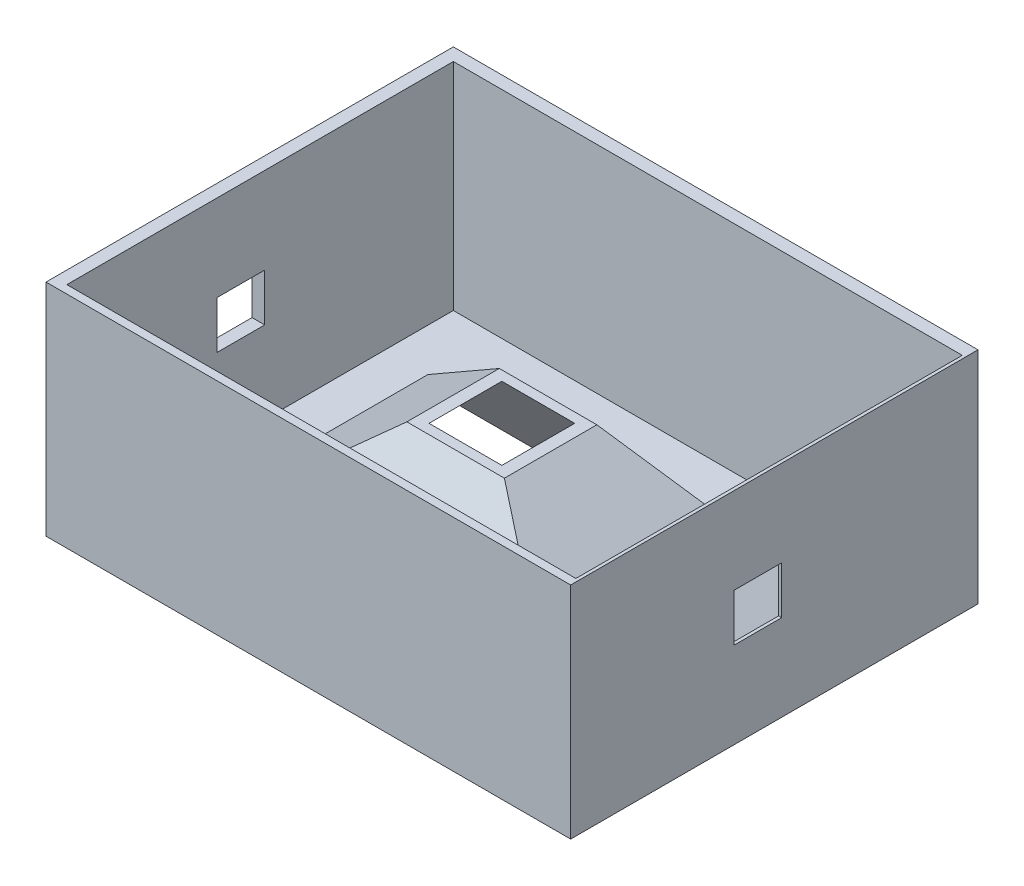
ISO-10303-21;
HEADER;
FILE_DESCRIPTION(('STEP AP214'),'2;1');
FILE_NAME('part.step','',(''),(''),'','','');
FILE_SCHEMA(('AUTOMOTIVE_DESIGN { 1 0 10303 214 1 1 1 1 }'));
ENDSEC;
DATA;
#1=APPLICATION_CONTEXT('core data for automotive mechanical design processes');
#2=APPLICATION_PROTOCOL_DEFINITION('international standard','automotive_design',2000,#1);
#3=PRODUCT_CONTEXT('',#1,'mechanical');
#4=PRODUCT('Part','Part','',(#3));
#5=PRODUCT_RELATED_PRODUCT_CATEGORY('part','',(#4));
#6=PRODUCT_DEFINITION_FORMATION('','',#4);
#7=PRODUCT_DEFINITION_CONTEXT('part definition',#1,'design');
#8=PRODUCT_DEFINITION('design','',#6,#7);
#9=PRODUCT_DEFINITION_SHAPE('','',#8);
#10=(LENGTH_UNIT() NAMED_UNIT(*) SI_UNIT(.MILLI.,.METRE.));
#11=(NAMED_UNIT(*) PLANE_ANGLE_UNIT() SI_UNIT($,.RADIAN.));
#12=(NAMED_UNIT(*) SI_UNIT($,.STERADIAN.) SOLID_ANGLE_UNIT());
#13=UNCERTAINTY_MEASURE_WITH_UNIT(LENGTH_MEASURE(1.E-05),#10,'distance_accuracy_value','');
#14=(GEOMETRIC_REPRESENTATION_CONTEXT(3) GLOBAL_UNCERTAINTY_ASSIGNED_CONTEXT((#13)) GLOBAL_UNIT_ASSIGNED_CONTEXT((#10,
#11,#12)) REPRESENTATION_CONTEXT('',''));
#15=CARTESIAN_POINT('',(0.,0.,0.));
#16=DIRECTION('',(0.,0.,1.));
#17=DIRECTION('',(1.,0.,0.));
#18=AXIS2_PLACEMENT_3D('',#15,#16,#17);
#19=CARTESIAN_POINT('',(-28.3594938145611,-48.5882852291101,56.9391919493883));
#20=DIRECTION('',(0.,1.,0.));
#21=DIRECTION('',(-1.,0.,0.));
#22=AXIS2_PLACEMENT_3D('',#19,#20,#21);
#23=PLANE('',#22);
#24=DIRECTION('',(-1.,0.,0.));
#25=VECTOR('',#24,1.);
#26=CARTESIAN_POINT('',(136.041599309488,-48.5882852291113,57.9748259053129));
#27=LINE('',#26,#25);
#28=CARTESIAN_POINT('',(134.350506185439,-48.5882852291113,57.9748259053129));
#29=VERTEX_POINT('',#28);
#30=CARTESIAN_POINT('',(-12.8594938145611,-48.5882852291103,57.9748259053129));
#31=VERTEX_POINT('',#30);
#32=EDGE_CURVE('E357',#29,#31,#27,.T.);
#33=ORIENTED_EDGE('',*,*,#32,.F.);
#34=DIRECTION('',(0.,0.,-1.));
#35=VECTOR('',#34,1.);
#36=CARTESIAN_POINT('',(134.350506185439,-48.5882852291113,56.9391919493883));
#37=LINE('',#36,#35);
#38=CARTESIAN_POINT('',(134.350506185439,-48.5882852291113,36.4391919493883));
#39=VERTEX_POINT('',#38);
#40=EDGE_CURVE('E422',#29,#39,#37,.T.);
#41=ORIENTED_EDGE('',*,*,#40,.T.);
#42=DIRECTION('',(-1.,0.,0.));
#43=VECTOR('',#42,1.);
#44=CARTESIAN_POINT('',(-28.3594938145611,-48.5882852291101,36.4391919493883));
#45=LINE('',#44,#43);
#46=CARTESIAN_POINT('',(-26.3594938145611,-48.5882852291102,36.4391919493883));
#47=VERTEX_POINT('',#46);
#48=EDGE_CURVE('E420',#39,#47,#45,.T.);
#49=ORIENTED_EDGE('',*,*,#48,.T.);
#50=DIRECTION('',(0.,0.,1.));
#51=VECTOR('',#50,1.);
#52=CARTESIAN_POINT('',(-26.3594938145611,-48.5882852291102,56.9391919493883));
#53=LINE('',#52,#51);
#54=CARTESIAN_POINT('',(-26.3594938145612,-48.5882852291102,158.464704984142));
#55=VERTEX_POINT('',#54);
#56=EDGE_CURVE('E418',#47,#55,#53,.T.);
#57=ORIENTED_EDGE('',*,*,#56,.T.);
#58=DIRECTION('',(1.,0.,0.));
#59=VECTOR('',#58,1.);
#60=CARTESIAN_POINT('',(-28.3594938145611,-48.5882852291102,158.464704984142));
#61=LINE('',#60,#59);
#62=CARTESIAN_POINT('',(-12.8594938145611,-48.5882852291103,158.464704984142));
#63=VERTEX_POINT('',#62);
#64=EDGE_CURVE('E398',#55,#63,#61,.T.);
#65=ORIENTED_EDGE('',*,*,#64,.T.);
#66=DIRECTION('',(0.,0.,1.));
#67=VECTOR('',#66,1.);
#68=CARTESIAN_POINT('',(-12.8594938145611,-48.5882852291103,56.9391919493883));
#69=LINE('',#68,#67);
#70=EDGE_CURVE('E360',#31,#63,#69,.T.);
#71=ORIENTED_EDGE('',*,*,#70,.F.);
#72=EDGE_LOOP('',(#33,#41,#49,#57,#65,#71));
#73=FACE_BOUND('',#72,.T.);
#74=ADVANCED_FACE('F91',(#73),#23,.T.);
#75=CARTESIAN_POINT('',(-10.6494938145611,-48.5212413100698,158.415521565134));
#76=DIRECTION('',(0.,0.591503475972063,0.806302448162578));
#77=DIRECTION('',(1.,0.,0.));
#78=AXIS2_PLACEMENT_3D('',#75,#76,#77);
#79=PLANE('',#78);
#80=DIRECTION('',(0.694725706687846,0.579953006668207,-0.425453525691797));
#81=VECTOR('',#80,1.);
#82=CARTESIAN_POINT('',(16.7301614495524,-23.8870119474395,140.343850904708));
#83=LINE('',#82,#81);
#84=CARTESIAN_POINT('',(45.3444130613901,0.,122.820338940067));
#85=VERTEX_POINT('',#84);
#86=EDGE_CURVE('E402',#63,#85,#83,.T.);
#87=ORIENTED_EDGE('',*,*,#86,.F.);
#88=DIRECTION('',(-1.,0.,0.));
#89=VECTOR('',#88,1.);
#90=CARTESIAN_POINT('',(136.041599309488,-48.5882852291113,158.464704984142));
#91=LINE('',#90,#89);
#92=CARTESIAN_POINT('',(134.350506185439,-48.5882852291113,158.464704984142));
#93=VERTEX_POINT('',#92);
#94=EDGE_CURVE('E354',#93,#63,#91,.T.);
#95=ORIENTED_EDGE('',*,*,#94,.F.);
#96=DIRECTION('',(-0.694725706687841,0.579953006668214,-0.425453525691795));
#97=VECTOR('',#96,1.);
#98=CARTESIAN_POINT('',(64.3256042288777,9.86809840605227,115.581101949387));
#99=LINE('',#98,#97);
#100=CARTESIAN_POINT('',(76.1465993094875,0.,122.820338940067));
#101=VERTEX_POINT('',#100);
#102=EDGE_CURVE('E400',#93,#101,#99,.T.);
#103=ORIENTED_EDGE('',*,*,#102,.T.);
#104=DIRECTION('',(1.,0.,0.));
#105=VECTOR('',#104,1.);
#106=CARTESIAN_POINT('',(6.30499229032088E-13,0.,122.820338940067));
#107=LINE('',#106,#105);
#108=EDGE_CURVE('E367',#85,#101,#107,.T.);
#109=ORIENTED_EDGE('',*,*,#108,.F.);
#110=EDGE_LOOP('',(#87,#95,#103,#109));
#111=FACE_BOUND('',#110,.T.);
#112=ADVANCED_FACE('F93',(#111),#79,.T.);
#113=CARTESIAN_POINT('',(132.140506185439,-48.5212413100708,58.024009324321));
#114=DIRECTION('',(0.,0.591503475972062,-0.806302448162579));
#115=DIRECTION('',(-1.,0.,0.));
#116=AXIS2_PLACEMENT_3D('',#113,#114,#115);
#117=PLANE('',#116);
#118=DIRECTION('',(-0.694725706687841,0.579953006668214,0.425453525691794));
#119=VECTOR('',#118,1.);
#120=CARTESIAN_POINT('',(104.760850921326,-23.8870119474403,76.0956799847464));
#121=LINE('',#120,#119);
#122=CARTESIAN_POINT('',(76.1465993094875,0.,93.6191919493883));
#123=VERTEX_POINT('',#122);
#124=EDGE_CURVE('E396',#29,#123,#121,.T.);
#125=ORIENTED_EDGE('',*,*,#124,.F.);
#126=ORIENTED_EDGE('',*,*,#32,.T.);
#127=DIRECTION('',(0.694725706687846,0.579953006668207,0.425453525691796));
#128=VECTOR('',#127,1.);
#129=CARTESIAN_POINT('',(57.1654081420003,9.86809840605238,100.858428940068));
#130=LINE('',#129,#128);
#131=CARTESIAN_POINT('',(45.3444130613901,0.,93.6191919493881));
#132=VERTEX_POINT('',#131);
#133=EDGE_CURVE('E399',#31,#132,#130,.T.);
#134=ORIENTED_EDGE('',*,*,#133,.T.);
#135=DIRECTION('',(-1.,0.,0.));
#136=VECTOR('',#135,1.);
#137=CARTESIAN_POINT('',(-4.80594898663319E-13,0.,93.6191919493879));
#138=LINE('',#137,#136);
#139=EDGE_CURVE('E408',#123,#132,#138,.T.);
#140=ORIENTED_EDGE('',*,*,#139,.F.);
#141=EDGE_LOOP('',(#125,#126,#134,#140));
#142=FACE_BOUND('',#141,.T.);
#143=ADVANCED_FACE('F465',(#142),#117,.T.);
#144=CARTESIAN_POINT('',(-12.2516088631539,-48.0808263832907,60.0397654447275));
#145=DIRECTION('',(-0.640846019437088,0.767669446683688,0.));
#146=DIRECTION('',(0.,0.,1.));
#147=AXIS2_PLACEMENT_3D('',#144,#145,#146);
#148=PLANE('',#147);
#149=ORIENTED_EDGE('',*,*,#133,.F.);
#150=ORIENTED_EDGE('',*,*,#70,.T.);
#151=ORIENTED_EDGE('',*,*,#86,.T.);
#152=DIRECTION('',(0.,0.,1.));
#153=VECTOR('',#152,1.);
#154=CARTESIAN_POINT('',(45.3444130613901,0.,0.));
#155=LINE('',#154,#153);
#156=EDGE_CURVE('E411',#132,#85,#155,.T.);
#157=ORIENTED_EDGE('',*,*,#156,.F.);
#158=EDGE_LOOP('',(#149,#150,#151,#157));
#159=FACE_BOUND('',#158,.T.);
#160=ADVANCED_FACE('F499',(#159),#148,.T.);
#161=CARTESIAN_POINT('',(133.742621234032,-48.0808263832917,156.399765444727));
#162=DIRECTION('',(0.640846019437095,0.767669446683682,0.));
#163=DIRECTION('',(0.,0.,-1.));
#164=AXIS2_PLACEMENT_3D('',#161,#162,#163);
#165=PLANE('',#164);
#166=DIRECTION('',(0.,0.,-1.));
#167=VECTOR('',#166,1.);
#168=CARTESIAN_POINT('',(134.350506185439,-48.5882852291113,159.500338940067));
#169=LINE('',#168,#167);
#170=EDGE_CURVE('E350',#93,#29,#169,.T.);
#171=ORIENTED_EDGE('',*,*,#170,.T.);
#172=ORIENTED_EDGE('',*,*,#124,.T.);
#173=DIRECTION('',(0.,0.,-1.));
#174=VECTOR('',#173,1.);
#175=CARTESIAN_POINT('',(76.1465993094875,0.,0.));
#176=LINE('',#175,#174);
#177=EDGE_CURVE('E403',#101,#123,#176,.T.);
#178=ORIENTED_EDGE('',*,*,#177,.F.);
#179=ORIENTED_EDGE('',*,*,#102,.F.);
#180=EDGE_LOOP('',(#171,#172,#178,#179));
#181=FACE_BOUND('',#180,.T.);
#182=ADVANCED_FACE('F492',(#181),#165,.T.);
#183=CARTESIAN_POINT('',(-3.4988469856525E-13,-50.,0.));
#184=DIRECTION('',(0.,1.,0.));
#185=DIRECTION('',(-1.,0.,0.));
#186=AXIS2_PLACEMENT_3D('',#183,#184,#185);
#187=PLANE('',#186);
#188=DIRECTION('',(-1.,0.,0.));
#189=VECTOR('',#188,1.);
#190=CARTESIAN_POINT('',(136.041599309488,-50.0000000000004,32.4391919493883));
#191=LINE('',#190,#189);
#192=CARTESIAN_POINT('',(135.311599309488,-50.0000000000004,32.4391919493883));
#193=VERTEX_POINT('',#192);
#194=CARTESIAN_POINT('',(-30.3594938145612,-49.9999999999998,32.4391919493883));
#195=VERTEX_POINT('',#194);
#196=EDGE_CURVE('E352',#193,#195,#191,.T.);
#197=ORIENTED_EDGE('',*,*,#196,.F.);
#198=DIRECTION('',(0.,0.,-1.));
#199=VECTOR('',#198,1.);
#200=CARTESIAN_POINT('',(135.311599309488,-50.0000000000004,162.549627647113));
#201=LINE('',#200,#199);
#202=CARTESIAN_POINT('',(135.311599309488,-50.0000000000004,161.060338940067));
#203=VERTEX_POINT('',#202);
#204=EDGE_CURVE('E348',#203,#193,#201,.T.);
#205=ORIENTED_EDGE('',*,*,#204,.F.);
#206=DIRECTION('',(1.,0.,0.));
#207=VECTOR('',#206,1.);
#208=CARTESIAN_POINT('',(-28.3588621198068,-49.9999999999998,161.060338940067));
#209=LINE('',#208,#207);
#210=CARTESIAN_POINT('',(-30.3594938145612,-49.9999999999998,161.060338940067));
#211=VERTEX_POINT('',#210);
#212=EDGE_CURVE('E341',#211,#203,#209,.T.);
#213=ORIENTED_EDGE('',*,*,#212,.F.);
#214=DIRECTION('',(0.,0.,1.));
#215=VECTOR('',#214,1.);
#216=CARTESIAN_POINT('',(-30.3594938145612,-49.9999999999998,32.4391919493883));
#217=LINE('',#216,#215);
#218=EDGE_CURVE('E336',#195,#211,#217,.T.);
#219=ORIENTED_EDGE('',*,*,#218,.F.);
#220=EDGE_LOOP('',(#197,#205,#213,#219));
#221=FACE_BOUND('',#220,.T.);
#222=DIRECTION('',(0.,0.,1.));
#223=VECTOR('',#222,1.);
#224=CARTESIAN_POINT('',(-10.6494938145612,-49.9999999999999,108.219765444727));
#225=LINE('',#224,#223);
#226=CARTESIAN_POINT('',(-10.6494938145612,-49.9999999999999,60.0397654447275));
#227=VERTEX_POINT('',#226);
#228=CARTESIAN_POINT('',(-10.6494938145612,-49.9999999999999,156.399765444727));
#229=VERTEX_POINT('',#228);
#230=EDGE_CURVE('E377',#227,#229,#225,.T.);
#231=ORIENTED_EDGE('',*,*,#230,.T.);
#232=DIRECTION('',(1.,0.,0.));
#233=VECTOR('',#232,1.);
#234=CARTESIAN_POINT('',(60.7455061854388,-50.0000000000004,156.399765444727));
#235=LINE('',#234,#233);
#236=CARTESIAN_POINT('',(132.140506185439,-50.0000000000009,156.399765444727));
#237=VERTEX_POINT('',#236);
#238=EDGE_CURVE('E382',#229,#237,#235,.T.);
#239=ORIENTED_EDGE('',*,*,#238,.T.);
#240=DIRECTION('',(0.,0.,-1.));
#241=VECTOR('',#240,1.);
#242=CARTESIAN_POINT('',(132.140506185439,-50.0000000000009,108.219765444727));
#243=LINE('',#242,#241);
#244=CARTESIAN_POINT('',(132.140506185439,-50.0000000000009,60.0397654447275));
#245=VERTEX_POINT('',#244);
#246=EDGE_CURVE('E364',#237,#245,#243,.T.);
#247=ORIENTED_EDGE('',*,*,#246,.T.);
#248=DIRECTION('',(-1.,0.,0.));
#249=VECTOR('',#248,1.);
#250=CARTESIAN_POINT('',(60.7455061854388,-50.0000000000004,60.0397654447275));
#251=LINE('',#250,#249);
#252=EDGE_CURVE('E371',#245,#227,#251,.T.);
#253=ORIENTED_EDGE('',*,*,#252,.T.);
#254=EDGE_LOOP('',(#231,#239,#247,#253));
#255=FACE_BOUND('',#254,.T.);
#256=ADVANCED_FACE('F489',(#221,#255),#187,.F.);
#257=CARTESIAN_POINT('',(0.,0.,0.));
#258=DIRECTION('',(0.,1.,0.));
#259=DIRECTION('',(0.,0.,1.));
#260=AXIS2_PLACEMENT_3D('',#257,#258,#259);
#261=PLANE('',#260);
#262=DIRECTION('',(0.,0.,-1.));
#263=VECTOR('',#262,1.);
#264=CARTESIAN_POINT('',(72.2455061854388,0.,108.219765444727));
#265=LINE('',#264,#263);
#266=CARTESIAN_POINT('',(72.2455061854388,0.,119.719765444727));
#267=VERTEX_POINT('',#266);
#268=CARTESIAN_POINT('',(72.2455061854388,0.,96.7197654447275));
#269=VERTEX_POINT('',#268);
#270=EDGE_CURVE('E388',#267,#269,#265,.T.);
#271=ORIENTED_EDGE('',*,*,#270,.F.);
#272=DIRECTION('',(1.,0.,0.));
#273=VECTOR('',#272,1.);
#274=CARTESIAN_POINT('',(60.7455061854388,0.,119.719765444727));
#275=LINE('',#274,#273);
#276=CARTESIAN_POINT('',(49.2455061854388,0.,119.719765444727));
#277=VERTEX_POINT('',#276);
#278=EDGE_CURVE('E363',#277,#267,#275,.T.);
#279=ORIENTED_EDGE('',*,*,#278,.F.);
#280=DIRECTION('',(0.,0.,1.));
#281=VECTOR('',#280,1.);
#282=CARTESIAN_POINT('',(49.2455061854388,0.,108.219765444727));
#283=LINE('',#282,#281);
#284=CARTESIAN_POINT('',(49.2455061854388,0.,96.7197654447275));
#285=VERTEX_POINT('',#284);
#286=EDGE_CURVE('E392',#285,#277,#283,.T.);
#287=ORIENTED_EDGE('',*,*,#286,.F.);
#288=DIRECTION('',(-1.,0.,0.));
#289=VECTOR('',#288,1.);
#290=CARTESIAN_POINT('',(60.7455061854388,0.,96.7197654447275));
#291=LINE('',#290,#289);
#292=EDGE_CURVE('E390',#269,#285,#291,.T.);
#293=ORIENTED_EDGE('',*,*,#292,.F.);
#294=EDGE_LOOP('',(#271,#279,#287,#293));
#295=FACE_BOUND('',#294,.T.);
#296=ORIENTED_EDGE('',*,*,#177,.T.);
#297=ORIENTED_EDGE('',*,*,#139,.T.);
#298=ORIENTED_EDGE('',*,*,#156,.T.);
#299=ORIENTED_EDGE('',*,*,#108,.T.);
#300=EDGE_LOOP('',(#296,#297,#298,#299));
#301=FACE_BOUND('',#300,.T.);
#302=ADVANCED_FACE('F476',(#295,#301),#261,.T.);
#303=CARTESIAN_POINT('',(132.140506185439,-50.0000000000009,156.399765444727));
#304=DIRECTION('',(0.640846019437095,0.767669446683682,0.));
#305=DIRECTION('',(0.,0.,-1.));
#306=AXIS2_PLACEMENT_3D('',#303,#304,#305);
#307=PLANE('',#306);
#308=ORIENTED_EDGE('',*,*,#246,.F.);
#309=DIRECTION('',(-0.694725706687841,0.579953006668214,-0.425453525691794));
#310=VECTOR('',#309,1.);
#311=CARTESIAN_POINT('',(102.193006185439,-25.0000000000005,138.059765444727));
#312=LINE('',#311,#310);
#313=EDGE_CURVE('E385',#237,#267,#312,.T.);
#314=ORIENTED_EDGE('',*,*,#313,.T.);
#315=ORIENTED_EDGE('',*,*,#270,.T.);
#316=DIRECTION('',(-0.694725706687841,0.579953006668214,0.425453525691794));
#317=VECTOR('',#316,1.);
#318=CARTESIAN_POINT('',(102.193006185439,-25.0000000000005,78.3797654447275));
#319=LINE('',#318,#317);
#320=EDGE_CURVE('E368',#245,#269,#319,.T.);
#321=ORIENTED_EDGE('',*,*,#320,.F.);
#322=EDGE_LOOP('',(#308,#314,#315,#321));
#323=FACE_BOUND('',#322,.T.);
#324=ADVANCED_FACE('F472',(#323),#307,.F.);
#325=CARTESIAN_POINT('',(132.140506185439,-50.0000000000009,60.0397654447275));
#326=DIRECTION('',(0.,0.591503475972062,-0.806302448162579));
#327=DIRECTION('',(-1.,0.,0.));
#328=AXIS2_PLACEMENT_3D('',#325,#326,#327);
#329=PLANE('',#328);
#330=ORIENTED_EDGE('',*,*,#252,.F.);
#331=ORIENTED_EDGE('',*,*,#320,.T.);
#332=ORIENTED_EDGE('',*,*,#292,.T.);
#333=DIRECTION('',(0.694725706687846,0.579953006668207,0.425453525691797));
#334=VECTOR('',#333,1.);
#335=CARTESIAN_POINT('',(19.2980061854388,-25.,78.3797654447275));
#336=LINE('',#335,#334);
#337=EDGE_CURVE('E374',#227,#285,#336,.T.);
#338=ORIENTED_EDGE('',*,*,#337,.F.);
#339=EDGE_LOOP('',(#330,#331,#332,#338));
#340=FACE_BOUND('',#339,.T.);
#341=ADVANCED_FACE('F475',(#340),#329,.F.);
#342=CARTESIAN_POINT('',(-10.6494938145612,-49.9999999999999,60.0397654447275));
#343=DIRECTION('',(-0.640846019437088,0.767669446683688,0.));
#344=DIRECTION('',(0.,0.,1.));
#345=AXIS2_PLACEMENT_3D('',#342,#343,#344);
#346=PLANE('',#345);
#347=ORIENTED_EDGE('',*,*,#230,.F.);
#348=ORIENTED_EDGE('',*,*,#337,.T.);
#349=ORIENTED_EDGE('',*,*,#286,.T.);
#350=DIRECTION('',(0.694725706687846,0.579953006668207,-0.425453525691797));
#351=VECTOR('',#350,1.);
#352=CARTESIAN_POINT('',(19.2980061854388,-25.,138.059765444727));
#353=LINE('',#352,#351);
#354=EDGE_CURVE('E380',#229,#277,#353,.T.);
#355=ORIENTED_EDGE('',*,*,#354,.F.);
#356=EDGE_LOOP('',(#347,#348,#349,#355));
#357=FACE_BOUND('',#356,.T.);
#358=ADVANCED_FACE('F480',(#357),#346,.F.);
#359=CARTESIAN_POINT('',(-10.6494938145612,-49.9999999999999,156.399765444727));
#360=DIRECTION('',(0.,0.591503475972063,0.806302448162578));
#361=DIRECTION('',(1.,0.,0.));
#362=AXIS2_PLACEMENT_3D('',#359,#360,#361);
#363=PLANE('',#362);
#364=ORIENTED_EDGE('',*,*,#238,.F.);
#365=ORIENTED_EDGE('',*,*,#354,.T.);
#366=ORIENTED_EDGE('',*,*,#278,.T.);
#367=ORIENTED_EDGE('',*,*,#313,.F.);
#368=EDGE_LOOP('',(#364,#365,#366,#367));
#369=FACE_BOUND('',#368,.T.);
#370=ADVANCED_FACE('F484',(#369),#363,.F.);
#371=CARTESIAN_POINT('',(0.,0.,32.4391919493883));
#372=DIRECTION('',(0.,0.,-1.));
#373=DIRECTION('',(-1.,0.,0.));
#374=AXIS2_PLACEMENT_3D('',#371,#372,#373);
#375=PLANE('',#374);
#376=DIRECTION('',(1.,0.,0.));
#377=VECTOR('',#376,1.);
#378=CARTESIAN_POINT('',(-30.3594938145607,19.5000000000002,32.4391919493883));
#379=LINE('',#378,#377);
#380=CARTESIAN_POINT('',(-30.3594938145607,19.5000000000002,32.4391919493883));
#381=VERTEX_POINT('',#380);
#382=CARTESIAN_POINT('',(135.311599309488,19.4999999999991,32.4391919493883));
#383=VERTEX_POINT('',#382);
#384=EDGE_CURVE('E324',#381,#383,#379,.T.);
#385=ORIENTED_EDGE('',*,*,#384,.T.);
#386=DIRECTION('',(0.,1.,0.));
#387=VECTOR('',#386,1.);
#388=CARTESIAN_POINT('',(135.311599309488,-48.5882852291113,32.4391919493883));
#389=LINE('',#388,#387);
#390=EDGE_CURVE('E346',#193,#383,#389,.T.);
#391=ORIENTED_EDGE('',*,*,#390,.F.);
#392=ORIENTED_EDGE('',*,*,#196,.T.);
#393=DIRECTION('',(0.,-1.,0.));
#394=VECTOR('',#393,1.);
#395=CARTESIAN_POINT('',(-30.3594938145612,-48.5882852291113,32.4391919493883));
#396=LINE('',#395,#394);
#397=EDGE_CURVE('E333',#381,#195,#396,.T.);
#398=ORIENTED_EDGE('',*,*,#397,.F.);
#399=EDGE_LOOP('',(#385,#391,#392,#398));
#400=FACE_BOUND('',#399,.T.);
#401=ADVANCED_FACE('F470',(#400),#375,.T.);
#402=CARTESIAN_POINT('',(135.311599309488,-48.5882852291113,162.549627647113));
#403=DIRECTION('',(-1.,0.,0.));
#404=DIRECTION('',(0.,0.,1.));
#405=AXIS2_PLACEMENT_3D('',#402,#403,#404);
#406=PLANE('',#405);
#407=DIRECTION('',(0.,0.,1.));
#408=VECTOR('',#407,1.);
#409=CARTESIAN_POINT('',(135.311599309488,-7.75000000000095,109.429765444727));
#410=LINE('',#409,#408);
#411=CARTESIAN_POINT('',(135.311599309488,-7.75000000000095,94.4297654447275));
#412=VERTEX_POINT('',#411);
#413=CARTESIAN_POINT('',(135.311599309488,-7.75000000000095,109.429765444727));
#414=VERTEX_POINT('',#413);
#415=EDGE_CURVE('E261',#412,#414,#410,.T.);
#416=ORIENTED_EDGE('',*,*,#415,.F.);
#417=DIRECTION('',(0.,1.,0.));
#418=VECTOR('',#417,1.);
#419=CARTESIAN_POINT('',(135.311599309488,-7.75000000000095,94.4297654447275));
#420=LINE('',#419,#418);
#421=CARTESIAN_POINT('',(135.311599309488,-22.7500000000009,94.4297654447275));
#422=VERTEX_POINT('',#421);
#423=EDGE_CURVE('E106',#422,#412,#420,.T.);
#424=ORIENTED_EDGE('',*,*,#423,.F.);
#425=DIRECTION('',(0.,0.,-1.));
#426=VECTOR('',#425,1.);
#427=CARTESIAN_POINT('',(135.311599309488,-22.7500000000009,109.429765444727));
#428=LINE('',#427,#426);
#429=CARTESIAN_POINT('',(135.311599309488,-22.7500000000009,109.429765444727));
#430=VERTEX_POINT('',#429);
#431=EDGE_CURVE('E268',#430,#422,#428,.T.);
#432=ORIENTED_EDGE('',*,*,#431,.F.);
#433=DIRECTION('',(0.,-1.,0.));
#434=VECTOR('',#433,1.);
#435=CARTESIAN_POINT('',(135.311599309488,-7.75000000000095,109.429765444727));
#436=LINE('',#435,#434);
#437=EDGE_CURVE('E252',#414,#430,#436,.T.);
#438=ORIENTED_EDGE('',*,*,#437,.F.);
#439=EDGE_LOOP('',(#416,#424,#432,#438));
#440=FACE_BOUND('',#439,.T.);
#441=ORIENTED_EDGE('',*,*,#390,.T.);
#442=DIRECTION('',(0.,0.,1.));
#443=VECTOR('',#442,1.);
#444=CARTESIAN_POINT('',(135.311599309488,19.4999999999991,161.060338940067));
#445=LINE('',#444,#443);
#446=CARTESIAN_POINT('',(135.311599309488,19.4999999999991,161.060338940067));
#447=VERTEX_POINT('',#446);
#448=EDGE_CURVE('E327',#383,#447,#445,.T.);
#449=ORIENTED_EDGE('',*,*,#448,.T.);
#450=DIRECTION('',(0.,1.,0.));
#451=VECTOR('',#450,1.);
#452=CARTESIAN_POINT('',(135.311599309488,-48.5882852291107,161.060338940067));
#453=LINE('',#452,#451);
#454=EDGE_CURVE('E344',#203,#447,#453,.T.);
#455=ORIENTED_EDGE('',*,*,#454,.F.);
#456=ORIENTED_EDGE('',*,*,#204,.T.);
#457=EDGE_LOOP('',(#441,#449,#455,#456));
#458=FACE_BOUND('',#457,.T.);
#459=ADVANCED_FACE('F265',(#440,#458),#406,.F.);
#460=CARTESIAN_POINT('',(0.,0.,161.060338940067));
#461=DIRECTION('',(0.,0.,1.));
#462=DIRECTION('',(1.,0.,0.));
#463=AXIS2_PLACEMENT_3D('',#460,#461,#462);
#464=PLANE('',#463);
#465=ORIENTED_EDGE('',*,*,#454,.T.);
#466=DIRECTION('',(-1.,0.,0.));
#467=VECTOR('',#466,1.);
#468=CARTESIAN_POINT('',(-30.3594938145607,19.5000000000002,161.060338940067));
#469=LINE('',#468,#467);
#470=CARTESIAN_POINT('',(-30.3594938145607,19.5000000000002,161.060338940067));
#471=VERTEX_POINT('',#470);
#472=EDGE_CURVE('E330',#447,#471,#469,.T.);
#473=ORIENTED_EDGE('',*,*,#472,.T.);
#474=DIRECTION('',(0.,1.,0.));
#475=VECTOR('',#474,1.);
#476=CARTESIAN_POINT('',(-30.3594938145612,-48.5882852291113,161.060338940067));
#477=LINE('',#476,#475);
#478=EDGE_CURVE('E339',#211,#471,#477,.T.);
#479=ORIENTED_EDGE('',*,*,#478,.F.);
#480=ORIENTED_EDGE('',*,*,#212,.T.);
#481=EDGE_LOOP('',(#465,#473,#479,#480));
#482=FACE_BOUND('',#481,.T.);
#483=ADVANCED_FACE('F550',(#482),#464,.T.);
#484=CARTESIAN_POINT('',(-30.3594938145608,2.22506098714559E-13,0.));
#485=DIRECTION('',(-1.,0.,0.));
#486=DIRECTION('',(0.,-1.,0.));
#487=AXIS2_PLACEMENT_3D('',#484,#485,#486);
#488=PLANE('',#487);
#489=DIRECTION('',(0.,1.,0.));
#490=VECTOR('',#489,1.);
#491=CARTESIAN_POINT('',(-30.3594938145608,-7.74999999999978,111.002084051681));
#492=LINE('',#491,#490);
#493=CARTESIAN_POINT('',(-30.359493814561,-22.7499999999998,111.002084051681));
#494=VERTEX_POINT('',#493);
#495=CARTESIAN_POINT('',(-30.3594938145608,-7.74999999999978,111.002084051681));
#496=VERTEX_POINT('',#495);
#497=EDGE_CURVE('E275',#494,#496,#492,.T.);
#498=ORIENTED_EDGE('',*,*,#497,.F.);
#499=DIRECTION('',(0.,0.,1.));
#500=VECTOR('',#499,1.);
#501=CARTESIAN_POINT('',(-30.359493814561,-22.7499999999998,96.0020840516812));
#502=LINE('',#501,#500);
#503=CARTESIAN_POINT('',(-30.359493814561,-22.7499999999998,96.0020840516812));
#504=VERTEX_POINT('',#503);
#505=EDGE_CURVE('E285',#504,#494,#502,.T.);
#506=ORIENTED_EDGE('',*,*,#505,.F.);
#507=DIRECTION('',(0.,-1.,0.));
#508=VECTOR('',#507,1.);
#509=CARTESIAN_POINT('',(-30.3594938145608,-7.74999999999978,96.0020840516812));
#510=LINE('',#509,#508);
#511=CARTESIAN_POINT('',(-30.3594938145608,-7.74999999999978,96.0020840516812));
#512=VERTEX_POINT('',#511);
#513=EDGE_CURVE('E282',#512,#504,#510,.T.);
#514=ORIENTED_EDGE('',*,*,#513,.F.);
#515=DIRECTION('',(0.,0.,-1.));
#516=VECTOR('',#515,1.);
#517=CARTESIAN_POINT('',(-30.3594938145608,-7.74999999999978,96.0020840516812));
#518=LINE('',#517,#516);
#519=EDGE_CURVE('E279',#496,#512,#518,.T.);
#520=ORIENTED_EDGE('',*,*,#519,.F.);
#521=EDGE_LOOP('',(#498,#506,#514,#520));
#522=FACE_BOUND('',#521,.T.);
#523=ORIENTED_EDGE('',*,*,#397,.T.);
#524=ORIENTED_EDGE('',*,*,#218,.T.);
#525=ORIENTED_EDGE('',*,*,#478,.T.);
#526=DIRECTION('',(0.,0.,-1.));
#527=VECTOR('',#526,1.);
#528=CARTESIAN_POINT('',(-30.3594938145607,19.5000000000002,161.060338940067));
#529=LINE('',#528,#527);
#530=EDGE_CURVE('E313',#471,#381,#529,.T.);
#531=ORIENTED_EDGE('',*,*,#530,.T.);
#532=EDGE_LOOP('',(#523,#524,#525,#531));
#533=FACE_BOUND('',#532,.T.);
#534=ADVANCED_FACE('F547',(#522,#533),#488,.T.);
#535=CARTESIAN_POINT('',(1.35851347719768E-13,19.5,0.));
#536=DIRECTION('',(0.,-1.,0.));
#537=DIRECTION('',(1.,0.,0.));
#538=AXIS2_PLACEMENT_3D('',#535,#536,#537);
#539=PLANE('',#538);
#540=DIRECTION('',(1.,0.,0.));
#541=VECTOR('',#540,1.);
#542=CARTESIAN_POINT('',(134.350506185439,19.4999999999991,36.4391919493883));
#543=LINE('',#542,#541);
#544=CARTESIAN_POINT('',(-26.3594938145607,19.5000000000002,36.4391919493883));
#545=VERTEX_POINT('',#544);
#546=CARTESIAN_POINT('',(134.350506185439,19.4999999999991,36.4391919493883));
#547=VERTEX_POINT('',#546);
#548=EDGE_CURVE('E306',#545,#547,#543,.T.);
#549=ORIENTED_EDGE('',*,*,#548,.T.);
#550=DIRECTION('',(0.,0.,1.));
#551=VECTOR('',#550,1.);
#552=CARTESIAN_POINT('',(134.350506185439,19.4999999999991,158.464704984142));
#553=LINE('',#552,#551);
#554=CARTESIAN_POINT('',(134.350506185439,19.4999999999991,158.464704984142));
#555=VERTEX_POINT('',#554);
#556=EDGE_CURVE('E291',#547,#555,#553,.T.);
#557=ORIENTED_EDGE('',*,*,#556,.T.);
#558=DIRECTION('',(-1.,0.,0.));
#559=VECTOR('',#558,1.);
#560=CARTESIAN_POINT('',(134.350506185439,19.4999999999991,158.464704984142));
#561=LINE('',#560,#559);
#562=CARTESIAN_POINT('',(-26.3594938145612,19.5000000000002,158.464704984142));
#563=VERTEX_POINT('',#562);
#564=EDGE_CURVE('E300',#555,#563,#561,.T.);
#565=ORIENTED_EDGE('',*,*,#564,.T.);
#566=DIRECTION('',(0.,0.,-1.));
#567=VECTOR('',#566,1.);
#568=CARTESIAN_POINT('',(-26.3594938145607,19.5000000000002,158.464704984142));
#569=LINE('',#568,#567);
#570=EDGE_CURVE('E303',#563,#545,#569,.T.);
#571=ORIENTED_EDGE('',*,*,#570,.T.);
#572=EDGE_LOOP('',(#549,#557,#565,#571));
#573=FACE_BOUND('',#572,.T.);
#574=ORIENTED_EDGE('',*,*,#530,.F.);
#575=ORIENTED_EDGE('',*,*,#472,.F.);
#576=ORIENTED_EDGE('',*,*,#448,.F.);
#577=ORIENTED_EDGE('',*,*,#384,.F.);
#578=EDGE_LOOP('',(#574,#575,#576,#577));
#579=FACE_BOUND('',#578,.T.);
#580=ADVANCED_FACE('F522',(#573,#579),#539,.F.);
#581=CARTESIAN_POINT('',(134.350506185439,19.4999999999991,158.464704984142));
#582=DIRECTION('',(1.,0.,0.));
#583=DIRECTION('',(0.,1.,0.));
#584=AXIS2_PLACEMENT_3D('',#581,#582,#583);
#585=PLANE('',#584);
#586=DIRECTION('',(0.,0.,-1.));
#587=VECTOR('',#586,1.);
#588=CARTESIAN_POINT('',(134.350506185439,-22.7500000000009,158.464704984142));
#589=LINE('',#588,#587);
#590=CARTESIAN_POINT('',(134.350506185439,-22.7500000000009,109.429765444727));
#591=VERTEX_POINT('',#590);
#592=CARTESIAN_POINT('',(134.350506185439,-22.7500000000009,94.4297654447275));
#593=VERTEX_POINT('',#592);
#594=EDGE_CURVE('E99',#591,#593,#589,.T.);
#595=ORIENTED_EDGE('',*,*,#594,.T.);
#596=DIRECTION('',(0.,1.,0.));
#597=VECTOR('',#596,1.);
#598=CARTESIAN_POINT('',(134.350506185439,19.4999999999991,94.4297654447275));
#599=LINE('',#598,#597);
#600=CARTESIAN_POINT('',(134.350506185439,-7.75000000000095,94.4297654447275));
#601=VERTEX_POINT('',#600);
#602=EDGE_CURVE('E12',#593,#601,#599,.T.);
#603=ORIENTED_EDGE('',*,*,#602,.T.);
#604=DIRECTION('',(0.,0.,1.));
#605=VECTOR('',#604,1.);
#606=CARTESIAN_POINT('',(134.350506185439,-7.75000000000095,158.464704984142));
#607=LINE('',#606,#605);
#608=CARTESIAN_POINT('',(134.350506185439,-7.75000000000095,109.429765444727));
#609=VERTEX_POINT('',#608);
#610=EDGE_CURVE('E436',#601,#609,#607,.T.);
#611=ORIENTED_EDGE('',*,*,#610,.T.);
#612=DIRECTION('',(0.,-1.,0.));
#613=VECTOR('',#612,1.);
#614=CARTESIAN_POINT('',(134.350506185439,19.4999999999991,109.429765444727));
#615=LINE('',#614,#613);
#616=EDGE_CURVE('E255',#609,#591,#615,.T.);
#617=ORIENTED_EDGE('',*,*,#616,.T.);
#618=EDGE_LOOP('',(#595,#603,#611,#617));
#619=FACE_BOUND('',#618,.T.);
#620=ORIENTED_EDGE('',*,*,#170,.F.);
#621=DIRECTION('',(0.,-1.,0.));
#622=VECTOR('',#621,1.);
#623=CARTESIAN_POINT('',(134.350506185439,19.4999999999991,158.464704984142));
#624=LINE('',#623,#622);
#625=EDGE_CURVE('E309',#555,#93,#624,.T.);
#626=ORIENTED_EDGE('',*,*,#625,.F.);
#627=ORIENTED_EDGE('',*,*,#556,.F.);
#628=DIRECTION('',(0.,-1.,0.));
#629=VECTOR('',#628,1.);
#630=CARTESIAN_POINT('',(134.350506185439,19.4999999999991,36.4391919493883));
#631=LINE('',#630,#629);
#632=EDGE_CURVE('E310',#547,#39,#631,.T.);
#633=ORIENTED_EDGE('',*,*,#632,.T.);
#634=ORIENTED_EDGE('',*,*,#40,.F.);
#635=EDGE_LOOP('',(#620,#626,#627,#633,#634));
#636=FACE_BOUND('',#635,.T.);
#637=ADVANCED_FACE('F440',(#619,#636),#585,.F.);
#638=CARTESIAN_POINT('',(134.350506185439,19.4999999999991,36.4391919493883));
#639=DIRECTION('',(0.,0.,-1.));
#640=DIRECTION('',(-1.,0.,0.));
#641=AXIS2_PLACEMENT_3D('',#638,#639,#640);
#642=PLANE('',#641);
#643=ORIENTED_EDGE('',*,*,#48,.F.);
#644=ORIENTED_EDGE('',*,*,#632,.F.);
#645=ORIENTED_EDGE('',*,*,#548,.F.);
#646=DIRECTION('',(0.,-1.,0.));
#647=VECTOR('',#646,1.);
#648=CARTESIAN_POINT('',(-26.3594938145607,19.5000000000002,36.4391919493883));
#649=LINE('',#648,#647);
#650=EDGE_CURVE('E314',#545,#47,#649,.T.);
#651=ORIENTED_EDGE('',*,*,#650,.T.);
#652=EDGE_LOOP('',(#643,#644,#645,#651));
#653=FACE_BOUND('',#652,.T.);
#654=ADVANCED_FACE('F527',(#653),#642,.F.);
#655=CARTESIAN_POINT('',(-26.3594938145607,19.5000000000002,158.464704984142));
#656=DIRECTION('',(-1.,0.,0.));
#657=DIRECTION('',(0.,-1.,0.));
#658=AXIS2_PLACEMENT_3D('',#655,#656,#657);
#659=PLANE('',#658);
#660=DIRECTION('',(0.,0.,1.));
#661=VECTOR('',#660,1.);
#662=CARTESIAN_POINT('',(-26.359493814561,-22.7499999999998,158.464704984142));
#663=LINE('',#662,#661);
#664=CARTESIAN_POINT('',(-26.3594938145609,-22.7499999999998,96.0020840516812));
#665=VERTEX_POINT('',#664);
#666=CARTESIAN_POINT('',(-26.359493814561,-22.7499999999998,111.002084051681));
#667=VERTEX_POINT('',#666);
#668=EDGE_CURVE('E430',#665,#667,#663,.T.);
#669=ORIENTED_EDGE('',*,*,#668,.T.);
#670=DIRECTION('',(0.,1.,0.));
#671=VECTOR('',#670,1.);
#672=CARTESIAN_POINT('',(-26.3594938145607,19.5000000000002,111.002084051681));
#673=LINE('',#672,#671);
#674=CARTESIAN_POINT('',(-26.3594938145609,-7.74999999999981,111.002084051681));
#675=VERTEX_POINT('',#674);
#676=EDGE_CURVE('E433',#667,#675,#673,.T.);
#677=ORIENTED_EDGE('',*,*,#676,.T.);
#678=DIRECTION('',(0.,0.,-1.));
#679=VECTOR('',#678,1.);
#680=CARTESIAN_POINT('',(-26.3594938145609,-7.74999999999981,158.464704984142));
#681=LINE('',#680,#679);
#682=CARTESIAN_POINT('',(-26.3594938145609,-7.74999999999981,96.0020840516812));
#683=VERTEX_POINT('',#682);
#684=EDGE_CURVE('E424',#675,#683,#681,.T.);
#685=ORIENTED_EDGE('',*,*,#684,.T.);
#686=DIRECTION('',(0.,-1.,0.));
#687=VECTOR('',#686,1.);
#688=CARTESIAN_POINT('',(-26.3594938145607,19.5000000000002,96.0020840516812));
#689=LINE('',#688,#687);
#690=EDGE_CURVE('E427',#683,#665,#689,.T.);
#691=ORIENTED_EDGE('',*,*,#690,.T.);
#692=EDGE_LOOP('',(#669,#677,#685,#691));
#693=FACE_BOUND('',#692,.T.);
#694=ORIENTED_EDGE('',*,*,#56,.F.);
#695=ORIENTED_EDGE('',*,*,#650,.F.);
#696=ORIENTED_EDGE('',*,*,#570,.F.);
#697=DIRECTION('',(0.,-1.,0.));
#698=VECTOR('',#697,1.);
#699=CARTESIAN_POINT('',(-26.3594938145607,19.5000000000002,158.464704984142));
#700=LINE('',#699,#698);
#701=EDGE_CURVE('E317',#563,#55,#700,.T.);
#702=ORIENTED_EDGE('',*,*,#701,.T.);
#703=EDGE_LOOP('',(#694,#695,#696,#702));
#704=FACE_BOUND('',#703,.T.);
#705=ADVANCED_FACE('F530',(#693,#704),#659,.F.);
#706=CARTESIAN_POINT('',(134.350506185439,19.4999999999991,158.464704984142));
#707=DIRECTION('',(0.,0.,1.));
#708=DIRECTION('',(1.,0.,0.));
#709=AXIS2_PLACEMENT_3D('',#706,#707,#708);
#710=PLANE('',#709);
#711=ORIENTED_EDGE('',*,*,#64,.F.);
#712=ORIENTED_EDGE('',*,*,#701,.F.);
#713=ORIENTED_EDGE('',*,*,#564,.F.);
#714=ORIENTED_EDGE('',*,*,#625,.T.);
#715=ORIENTED_EDGE('',*,*,#94,.T.);
#716=EDGE_LOOP('',(#711,#712,#713,#714,#715));
#717=FACE_BOUND('',#716,.T.);
#718=ADVANCED_FACE('F519',(#717),#710,.F.);
#719=CARTESIAN_POINT('',(-20.3594938145608,-7.74999999999985,111.002084051681));
#720=DIRECTION('',(0.,0.,1.));
#721=DIRECTION('',(1.,0.,0.));
#722=AXIS2_PLACEMENT_3D('',#719,#720,#721);
#723=PLANE('',#722);
#724=DIRECTION('',(-1.,0.,0.));
#725=VECTOR('',#724,1.);
#726=CARTESIAN_POINT('',(-20.359493814561,-22.7499999999999,111.002084051681));
#727=LINE('',#726,#725);
#728=EDGE_CURVE('E289',#667,#494,#727,.T.);
#729=ORIENTED_EDGE('',*,*,#728,.T.);
#730=ORIENTED_EDGE('',*,*,#497,.T.);
#731=DIRECTION('',(-1.,0.,0.));
#732=VECTOR('',#731,1.);
#733=CARTESIAN_POINT('',(-20.3594938145608,-7.74999999999985,111.002084051681));
#734=LINE('',#733,#732);
#735=EDGE_CURVE('E288',#675,#496,#734,.T.);
#736=ORIENTED_EDGE('',*,*,#735,.F.);
#737=ORIENTED_EDGE('',*,*,#676,.F.);
#738=EDGE_LOOP('',(#729,#730,#736,#737));
#739=FACE_BOUND('',#738,.T.);
#740=ADVANCED_FACE('F538',(#739),#723,.F.);
#741=CARTESIAN_POINT('',(-20.359493814561,-22.7499999999999,96.0020840516812));
#742=DIRECTION('',(0.,-1.,0.));
#743=DIRECTION('',(1.,0.,0.));
#744=AXIS2_PLACEMENT_3D('',#741,#742,#743);
#745=PLANE('',#744);
#746=DIRECTION('',(-1.,0.,0.));
#747=VECTOR('',#746,1.);
#748=CARTESIAN_POINT('',(-20.359493814561,-22.7499999999999,96.0020840516812));
#749=LINE('',#748,#747);
#750=EDGE_CURVE('E292',#665,#504,#749,.T.);
#751=ORIENTED_EDGE('',*,*,#750,.T.);
#752=ORIENTED_EDGE('',*,*,#505,.T.);
#753=ORIENTED_EDGE('',*,*,#728,.F.);
#754=ORIENTED_EDGE('',*,*,#668,.F.);
#755=EDGE_LOOP('',(#751,#752,#753,#754));
#756=FACE_BOUND('',#755,.T.);
#757=ADVANCED_FACE('F740',(#756),#745,.F.);
#758=CARTESIAN_POINT('',(-20.3594938145608,-7.74999999999985,96.0020840516812));
#759=DIRECTION('',(0.,0.,-1.));
#760=DIRECTION('',(-1.,0.,0.));
#761=AXIS2_PLACEMENT_3D('',#758,#759,#760);
#762=PLANE('',#761);
#763=DIRECTION('',(-1.,0.,0.));
#764=VECTOR('',#763,1.);
#765=CARTESIAN_POINT('',(-20.3594938145608,-7.74999999999985,96.0020840516812));
#766=LINE('',#765,#764);
#767=EDGE_CURVE('E294',#683,#512,#766,.T.);
#768=ORIENTED_EDGE('',*,*,#767,.T.);
#769=ORIENTED_EDGE('',*,*,#513,.T.);
#770=ORIENTED_EDGE('',*,*,#750,.F.);
#771=ORIENTED_EDGE('',*,*,#690,.F.);
#772=EDGE_LOOP('',(#768,#769,#770,#771));
#773=FACE_BOUND('',#772,.T.);
#774=ADVANCED_FACE('F454',(#773),#762,.F.);
#775=CARTESIAN_POINT('',(-20.3594938145608,-7.74999999999985,96.0020840516812));
#776=DIRECTION('',(0.,1.,0.));
#777=DIRECTION('',(-1.,0.,0.));
#778=AXIS2_PLACEMENT_3D('',#775,#776,#777);
#779=PLANE('',#778);
#780=ORIENTED_EDGE('',*,*,#735,.T.);
#781=ORIENTED_EDGE('',*,*,#519,.T.);
#782=ORIENTED_EDGE('',*,*,#767,.F.);
#783=ORIENTED_EDGE('',*,*,#684,.F.);
#784=EDGE_LOOP('',(#780,#781,#782,#783));
#785=FACE_BOUND('',#784,.T.);
#786=ADVANCED_FACE('F447',(#785),#779,.F.);
#787=CARTESIAN_POINT('',(125.311599309488,-7.75000000000095,94.4297654447275));
#788=DIRECTION('',(0.,0.,-1.));
#789=DIRECTION('',(-1.,0.,0.));
#790=AXIS2_PLACEMENT_3D('',#787,#788,#789);
#791=PLANE('',#790);
#792=DIRECTION('',(1.,0.,0.));
#793=VECTOR('',#792,1.);
#794=CARTESIAN_POINT('',(125.311599309488,-22.7500000000009,94.4297654447275));
#795=LINE('',#794,#793);
#796=EDGE_CURVE('E273',#593,#422,#795,.T.);
#797=ORIENTED_EDGE('',*,*,#796,.T.);
#798=ORIENTED_EDGE('',*,*,#423,.T.);
#799=DIRECTION('',(1.,0.,0.));
#800=VECTOR('',#799,1.);
#801=CARTESIAN_POINT('',(125.311599309488,-7.75000000000095,94.4297654447275));
#802=LINE('',#801,#800);
#803=EDGE_CURVE('E258',#601,#412,#802,.T.);
#804=ORIENTED_EDGE('',*,*,#803,.F.);
#805=ORIENTED_EDGE('',*,*,#602,.F.);
#806=EDGE_LOOP('',(#797,#798,#804,#805));
#807=FACE_BOUND('',#806,.T.);
#808=ADVANCED_FACE('F445',(#807),#791,.F.);
#809=CARTESIAN_POINT('',(125.311599309488,-22.7500000000009,109.429765444727));
#810=DIRECTION('',(0.,-1.,0.));
#811=DIRECTION('',(0.,0.,-1.));
#812=AXIS2_PLACEMENT_3D('',#809,#810,#811);
#813=PLANE('',#812);
#814=DIRECTION('',(1.,0.,0.));
#815=VECTOR('',#814,1.);
#816=CARTESIAN_POINT('',(125.311599309488,-22.7500000000009,109.429765444727));
#817=LINE('',#816,#815);
#818=EDGE_CURVE('E257',#591,#430,#817,.T.);
#819=ORIENTED_EDGE('',*,*,#818,.T.);
#820=ORIENTED_EDGE('',*,*,#431,.T.);
#821=ORIENTED_EDGE('',*,*,#796,.F.);
#822=ORIENTED_EDGE('',*,*,#594,.F.);
#823=EDGE_LOOP('',(#819,#820,#821,#822));
#824=FACE_BOUND('',#823,.T.);
#825=ADVANCED_FACE('F444',(#824),#813,.F.);
#826=CARTESIAN_POINT('',(125.311599309488,-7.75000000000095,109.429765444727));
#827=DIRECTION('',(0.,0.,1.));
#828=DIRECTION('',(1.,0.,0.));
#829=AXIS2_PLACEMENT_3D('',#826,#827,#828);
#830=PLANE('',#829);
#831=DIRECTION('',(1.,0.,0.));
#832=VECTOR('',#831,1.);
#833=CARTESIAN_POINT('',(125.311599309488,-7.75000000000095,109.429765444727));
#834=LINE('',#833,#832);
#835=EDGE_CURVE('E114',#609,#414,#834,.T.);
#836=ORIENTED_EDGE('',*,*,#835,.T.);
#837=ORIENTED_EDGE('',*,*,#437,.T.);
#838=ORIENTED_EDGE('',*,*,#818,.F.);
#839=ORIENTED_EDGE('',*,*,#616,.F.);
#840=EDGE_LOOP('',(#836,#837,#838,#839));
#841=FACE_BOUND('',#840,.T.);
#842=ADVANCED_FACE('F249',(#841),#830,.F.);
#843=CARTESIAN_POINT('',(125.311599309488,-7.75000000000095,109.429765444727));
#844=DIRECTION('',(0.,1.,0.));
#845=DIRECTION('',(0.,0.,1.));
#846=AXIS2_PLACEMENT_3D('',#843,#844,#845);
#847=PLANE('',#846);
#848=ORIENTED_EDGE('',*,*,#803,.T.);
#849=ORIENTED_EDGE('',*,*,#415,.T.);
#850=ORIENTED_EDGE('',*,*,#835,.F.);
#851=ORIENTED_EDGE('',*,*,#610,.F.);
#852=EDGE_LOOP('',(#848,#849,#850,#851));
#853=FACE_BOUND('',#852,.T.);
#854=ADVANCED_FACE('F262',(#853),#847,.F.);
#855=CLOSED_SHELL('',(#74,#112,#143,#160,#182,#256,#302,#324,#341,#358,#370,#401,#459,#483,#534,
#580,#637,#654,#705,#718,#740,#757,#774,#786,#808,#825,#842,#854));
#856=MANIFOLD_SOLID_BREP('B2',#855);
#857=ADVANCED_BREP_SHAPE_REPRESENTATION('',(#18,#856),#14);
#858=SHAPE_DEFINITION_REPRESENTATION(#9,#857);
ENDSEC;
END-ISO-10303-21;
